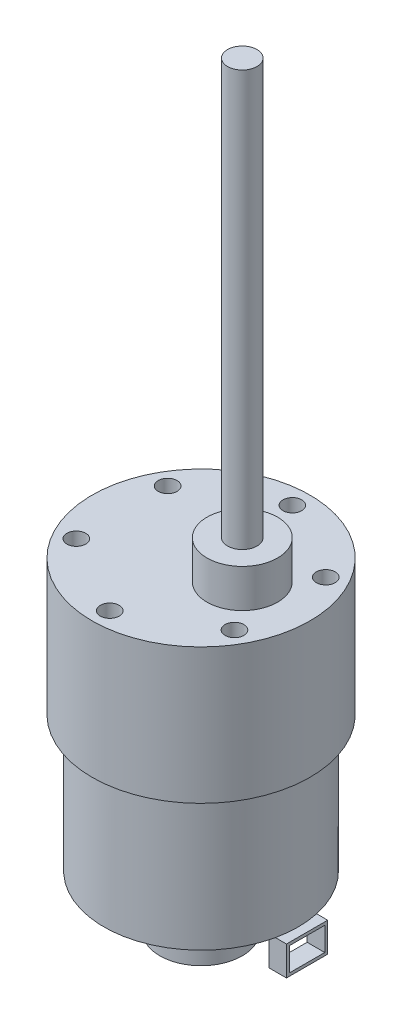
ISO-10303-21;
HEADER;
FILE_DESCRIPTION(('STEP AP214'),'2;1');
FILE_NAME('part.step','',(''),(''),'','','');
FILE_SCHEMA(('AUTOMOTIVE_DESIGN { 1 0 10303 214 1 1 1 1 }'));
ENDSEC;
DATA;
#1=APPLICATION_CONTEXT('core data for automotive mechanical design processes');
#2=APPLICATION_PROTOCOL_DEFINITION('international standard','automotive_design',2000,#1);
#3=PRODUCT_CONTEXT('',#1,'mechanical');
#4=PRODUCT('Part','Part','',(#3));
#5=PRODUCT_RELATED_PRODUCT_CATEGORY('part','',(#4));
#6=PRODUCT_DEFINITION_FORMATION('','',#4);
#7=PRODUCT_DEFINITION_CONTEXT('part definition',#1,'design');
#8=PRODUCT_DEFINITION('design','',#6,#7);
#9=PRODUCT_DEFINITION_SHAPE('','',#8);
#10=(LENGTH_UNIT() NAMED_UNIT(*) SI_UNIT(.MILLI.,.METRE.));
#11=(NAMED_UNIT(*) PLANE_ANGLE_UNIT() SI_UNIT($,.RADIAN.));
#12=(NAMED_UNIT(*) SI_UNIT($,.STERADIAN.) SOLID_ANGLE_UNIT());
#13=UNCERTAINTY_MEASURE_WITH_UNIT(LENGTH_MEASURE(1.E-05),#10,'distance_accuracy_value','');
#14=(GEOMETRIC_REPRESENTATION_CONTEXT(3) GLOBAL_UNCERTAINTY_ASSIGNED_CONTEXT((#13)) GLOBAL_UNIT_ASSIGNED_CONTEXT((#10,
#11,#12)) REPRESENTATION_CONTEXT('',''));
#15=CARTESIAN_POINT('',(0.,0.,0.));
#16=DIRECTION('',(0.,0.,1.));
#17=DIRECTION('',(1.,0.,0.));
#18=AXIS2_PLACEMENT_3D('',#15,#16,#17);
#19=CARTESIAN_POINT('',(0.,46.,0.));
#20=DIRECTION('',(0.,1.,0.));
#21=DIRECTION('',(0.,0.,1.));
#22=AXIS2_PLACEMENT_3D('',#19,#20,#21);
#23=PLANE('',#22);
#24=CARTESIAN_POINT('',(-13.4233937586588,46.,7.75000000000006));
#25=DIRECTION('',(0.,1.,0.));
#26=DIRECTION('',(0.,0.,1.));
#27=AXIS2_PLACEMENT_3D('',#24,#25,#26);
#28=CIRCLE('',#27,1.6);
#29=CARTESIAN_POINT('',(-13.4233937586588,46.,9.35000000000006));
#30=VERTEX_POINT('',#29);
#31=EDGE_CURVE('E538',#30,#30,#28,.T.);
#32=ORIENTED_EDGE('',*,*,#31,.F.);
#33=EDGE_LOOP('',(#32));
#34=FACE_BOUND('',#33,.T.);
#35=CARTESIAN_POINT('',(1.08235921504137E-13,46.,15.5));
#36=DIRECTION('',(0.,1.,0.));
#37=DIRECTION('',(0.,0.,1.));
#38=AXIS2_PLACEMENT_3D('',#35,#36,#37);
#39=CIRCLE('',#38,1.6);
#40=CARTESIAN_POINT('',(1.08235921504137E-13,46.,17.1));
#41=VERTEX_POINT('',#40);
#42=EDGE_CURVE('E537',#41,#41,#39,.T.);
#43=ORIENTED_EDGE('',*,*,#42,.F.);
#44=EDGE_LOOP('',(#43));
#45=FACE_BOUND('',#44,.T.);
#46=CARTESIAN_POINT('',(13.4233937586589,46.,7.74999999999987));
#47=DIRECTION('',(0.,1.,0.));
#48=DIRECTION('',(0.,0.,1.));
#49=AXIS2_PLACEMENT_3D('',#46,#47,#48);
#50=CIRCLE('',#49,1.6);
#51=CARTESIAN_POINT('',(13.4233937586589,46.,9.34999999999988));
#52=VERTEX_POINT('',#51);
#53=EDGE_CURVE('E547',#52,#52,#50,.T.);
#54=ORIENTED_EDGE('',*,*,#53,.F.);
#55=EDGE_LOOP('',(#54));
#56=FACE_BOUND('',#55,.T.);
#57=CARTESIAN_POINT('',(13.4233937586587,46.,-7.75000000000016));
#58=DIRECTION('',(0.,1.,0.));
#59=DIRECTION('',(0.,0.,1.));
#60=AXIS2_PLACEMENT_3D('',#57,#58,#59);
#61=CIRCLE('',#60,1.6);
#62=CARTESIAN_POINT('',(13.4233937586587,46.,-6.15000000000016));
#63=VERTEX_POINT('',#62);
#64=EDGE_CURVE('E552',#63,#63,#61,.T.);
#65=ORIENTED_EDGE('',*,*,#64,.F.);
#66=EDGE_LOOP('',(#65));
#67=FACE_BOUND('',#66,.T.);
#68=CARTESIAN_POINT('',(0.,46.,-15.5));
#69=DIRECTION('',(0.,1.,0.));
#70=DIRECTION('',(0.,0.,1.));
#71=AXIS2_PLACEMENT_3D('',#68,#69,#70);
#72=CIRCLE('',#71,1.6);
#73=CARTESIAN_POINT('',(0.,46.,-13.9));
#74=VERTEX_POINT('',#73);
#75=EDGE_CURVE('E558',#74,#74,#72,.T.);
#76=ORIENTED_EDGE('',*,*,#75,.F.);
#77=EDGE_LOOP('',(#76));
#78=FACE_BOUND('',#77,.T.);
#79=CARTESIAN_POINT('',(-13.4233937586588,46.,-7.74999999999997));
#80=DIRECTION('',(0.,1.,0.));
#81=DIRECTION('',(0.,0.,1.));
#82=AXIS2_PLACEMENT_3D('',#79,#80,#81);
#83=CIRCLE('',#82,1.6);
#84=CARTESIAN_POINT('',(-13.4233937586588,46.,-6.14999999999997));
#85=VERTEX_POINT('',#84);
#86=EDGE_CURVE('E564',#85,#85,#83,.T.);
#87=ORIENTED_EDGE('',*,*,#86,.F.);
#88=EDGE_LOOP('',(#87));
#89=FACE_BOUND('',#88,.T.);
#90=CARTESIAN_POINT('',(7.,46.,0.));
#91=DIRECTION('',(0.,1.,0.));
#92=DIRECTION('',(0.,0.,1.));
#93=AXIS2_PLACEMENT_3D('',#90,#91,#92);
#94=CIRCLE('',#93,6.);
#95=CARTESIAN_POINT('',(7.,46.,-6.));
#96=VERTEX_POINT('',#95);
#97=EDGE_CURVE('E131',#96,#96,#94,.T.);
#98=ORIENTED_EDGE('',*,*,#97,.F.);
#99=EDGE_LOOP('',(#98));
#100=FACE_BOUND('',#99,.T.);
#101=CARTESIAN_POINT('',(0.,46.,0.));
#102=DIRECTION('',(0.,1.,0.));
#103=DIRECTION('',(0.,0.,1.));
#104=AXIS2_PLACEMENT_3D('',#101,#102,#103);
#105=CIRCLE('',#104,18.5);
#106=CARTESIAN_POINT('',(0.,46.,18.5));
#107=VERTEX_POINT('',#106);
#108=EDGE_CURVE('E570',#107,#107,#105,.T.);
#109=ORIENTED_EDGE('',*,*,#108,.T.);
#110=EDGE_LOOP('',(#109));
#111=FACE_BOUND('',#110,.T.);
#112=ADVANCED_FACE('F36',(#34,#45,#56,#67,#78,#89,#100,#111),#23,.T.);
#113=CARTESIAN_POINT('',(7.,52.5,0.));
#114=DIRECTION('',(0.,-1.,0.));
#115=DIRECTION('',(0.,0.,-1.));
#116=AXIS2_PLACEMENT_3D('',#113,#114,#115);
#117=CYLINDRICAL_SURFACE('',#116,6.);
#118=CARTESIAN_POINT('',(7.,52.5,0.));
#119=DIRECTION('',(0.,1.,0.));
#120=DIRECTION('',(0.,0.,1.));
#121=AXIS2_PLACEMENT_3D('',#118,#119,#120);
#122=CIRCLE('',#121,6.);
#123=CARTESIAN_POINT('',(7.,52.5,-6.));
#124=VERTEX_POINT('',#123);
#125=EDGE_CURVE('E138',#124,#124,#122,.T.);
#126=CARTESIAN_POINT('',(7.,52.5,-6.));
#127=CARTESIAN_POINT('',(7.,52.4322916666667,-6.));
#128=CARTESIAN_POINT('',(7.,52.3645833333333,-6.));
#129=CARTESIAN_POINT('',(7.,52.2291666666667,-6.));
#130=CARTESIAN_POINT('',(7.,52.1614583333333,-6.));
#131=CARTESIAN_POINT('',(7.,52.0260416666667,-6.));
#132=CARTESIAN_POINT('',(7.,51.9583333333333,-6.));
#133=CARTESIAN_POINT('',(7.,51.8229166666667,-6.));
#134=CARTESIAN_POINT('',(7.,51.7552083333333,-6.));
#135=CARTESIAN_POINT('',(7.,51.6197916666667,-6.));
#136=CARTESIAN_POINT('',(7.,51.5520833333333,-6.));
#137=CARTESIAN_POINT('',(7.,51.4166666666667,-6.));
#138=CARTESIAN_POINT('',(7.,51.3489583333333,-6.));
#139=CARTESIAN_POINT('',(7.,51.2135416666667,-6.));
#140=CARTESIAN_POINT('',(7.,51.1458333333333,-6.));
#141=CARTESIAN_POINT('',(7.,51.0104166666667,-6.));
#142=CARTESIAN_POINT('',(7.,50.9427083333333,-6.));
#143=CARTESIAN_POINT('',(7.,50.8072916666667,-6.));
#144=CARTESIAN_POINT('',(7.,50.7395833333333,-6.));
#145=CARTESIAN_POINT('',(7.,50.6041666666667,-6.));
#146=CARTESIAN_POINT('',(7.,50.5364583333333,-6.));
#147=CARTESIAN_POINT('',(7.,50.4010416666667,-6.));
#148=CARTESIAN_POINT('',(7.,50.3333333333333,-6.));
#149=CARTESIAN_POINT('',(7.,50.1979166666667,-6.));
#150=CARTESIAN_POINT('',(7.,50.1302083333333,-6.));
#151=CARTESIAN_POINT('',(7.,49.9947916666667,-6.));
#152=CARTESIAN_POINT('',(7.,49.9270833333333,-6.));
#153=CARTESIAN_POINT('',(7.,49.7916666666667,-6.));
#154=CARTESIAN_POINT('',(7.,49.7239583333333,-6.));
#155=CARTESIAN_POINT('',(7.,49.5885416666667,-6.));
#156=CARTESIAN_POINT('',(7.,49.5208333333333,-6.));
#157=CARTESIAN_POINT('',(7.,49.3854166666667,-6.));
#158=CARTESIAN_POINT('',(7.,49.3177083333333,-6.));
#159=CARTESIAN_POINT('',(7.,49.1822916666667,-6.));
#160=CARTESIAN_POINT('',(7.,49.1145833333333,-6.));
#161=CARTESIAN_POINT('',(7.,48.9791666666667,-6.));
#162=CARTESIAN_POINT('',(7.,48.9114583333333,-6.));
#163=CARTESIAN_POINT('',(7.,48.7760416666667,-6.));
#164=CARTESIAN_POINT('',(7.,48.7083333333333,-6.));
#165=CARTESIAN_POINT('',(7.,48.5729166666667,-6.));
#166=CARTESIAN_POINT('',(7.,48.5052083333333,-6.));
#167=CARTESIAN_POINT('',(7.,48.3697916666667,-6.));
#168=CARTESIAN_POINT('',(7.,48.3020833333333,-6.));
#169=CARTESIAN_POINT('',(7.,48.1666666666667,-6.));
#170=CARTESIAN_POINT('',(7.,48.0989583333333,-6.));
#171=CARTESIAN_POINT('',(7.,47.9635416666667,-6.));
#172=CARTESIAN_POINT('',(7.,47.8958333333333,-6.));
#173=CARTESIAN_POINT('',(7.,47.7604166666667,-6.));
#174=CARTESIAN_POINT('',(7.,47.6927083333333,-6.));
#175=CARTESIAN_POINT('',(7.,47.5572916666667,-6.));
#176=CARTESIAN_POINT('',(7.,47.4895833333333,-6.));
#177=CARTESIAN_POINT('',(7.,47.3541666666667,-6.));
#178=CARTESIAN_POINT('',(7.,47.2864583333333,-6.));
#179=CARTESIAN_POINT('',(7.,47.1510416666667,-6.));
#180=CARTESIAN_POINT('',(7.,47.0833333333333,-6.));
#181=CARTESIAN_POINT('',(7.,46.9479166666667,-6.));
#182=CARTESIAN_POINT('',(7.,46.8802083333333,-6.));
#183=CARTESIAN_POINT('',(7.,46.7447916666667,-6.));
#184=CARTESIAN_POINT('',(7.,46.6770833333333,-6.));
#185=CARTESIAN_POINT('',(7.,46.5416666666667,-6.));
#186=CARTESIAN_POINT('',(7.,46.4739583333333,-6.));
#187=CARTESIAN_POINT('',(7.,46.3385416666667,-6.));
#188=CARTESIAN_POINT('',(7.,46.2708333333333,-6.));
#189=CARTESIAN_POINT('',(7.,46.1354166666667,-6.));
#190=CARTESIAN_POINT('',(7.,46.0677083333333,-6.));
#191=CARTESIAN_POINT('',(7.,46.,-6.));
#192=B_SPLINE_CURVE_WITH_KNOTS('',3,(#126,#127,#128,#129,#130,#131,#132,#133,#134,#135,#136,
#137,#138,#139,#140,#141,#142,#143,#144,#145,#146,#147,#148,#149,#150,#151,#152,#153,#154,#155,
#156,#157,#158,#159,#160,#161,#162,#163,#164,#165,#166,#167,#168,#169,#170,#171,#172,#173,#174,
#175,#176,#177,#178,#179,#180,#181,#182,#183,#184,#185,#186,#187,#188,#189,#190,#191),
.UNSPECIFIED.,.F.,.F.,(4,2,2,2,2,2,2,2,2,2,2,2,2,2,2,2,2,2,2,2,2,2,2,2,2,2,2,2,2,2,2,2,4),(0.,
0.203124999999998,0.406249999999997,0.609374999999995,0.812499999999994,1.015625,1.21875,
1.421875,1.62499999999999,1.828125,2.03125,2.234375,2.4375,2.64062499999999,2.84375,3.046875,
3.25,3.45312499999999,3.65625,3.859375,4.0625,4.26562499999999,4.46874999999999,4.671875,4.875,
5.078125,5.28124999999999,5.484375,5.6875,5.890625,6.09374999999999,6.29687499999999,6.5),.UNSPECIFIED.);
#193=EDGE_CURVE('BSEAM230',#124,#96,#192,.T.);
#194=ORIENTED_EDGE('',*,*,#125,.F.);
#195=ORIENTED_EDGE('',*,*,#97,.T.);
#196=ORIENTED_EDGE('',*,*,#193,.T.);
#197=ORIENTED_EDGE('',*,*,#193,.F.);
#198=EDGE_LOOP('',(#194,#196,#195,#197));
#199=FACE_BOUND('',#198,.T.);
#200=ADVANCED_FACE('F230',(#199),#117,.T.);
#201=CARTESIAN_POINT('',(7.,52.5,0.));
#202=DIRECTION('',(0.,1.,0.));
#203=DIRECTION('',(0.,0.,1.));
#204=AXIS2_PLACEMENT_3D('',#201,#202,#203);
#205=PLANE('',#204);
#206=CARTESIAN_POINT('',(7.,52.5,0.));
#207=DIRECTION('',(0.,1.,0.));
#208=DIRECTION('',(0.,0.,1.));
#209=AXIS2_PLACEMENT_3D('',#206,#207,#208);
#210=CIRCLE('',#209,2.5);
#211=CARTESIAN_POINT('',(7.,52.5,2.5));
#212=VERTEX_POINT('',#211);
#213=EDGE_CURVE('E576',#212,#212,#210,.T.);
#214=ORIENTED_EDGE('',*,*,#213,.F.);
#215=EDGE_LOOP('',(#214));
#216=FACE_BOUND('',#215,.T.);
#217=ORIENTED_EDGE('',*,*,#125,.T.);
#218=EDGE_LOOP('',(#217));
#219=FACE_BOUND('',#218,.T.);
#220=ADVANCED_FACE('F236',(#216,#219),#205,.T.);
#221=CARTESIAN_POINT('',(7.,123.,0.));
#222=DIRECTION('',(0.,-1.,0.));
#223=DIRECTION('',(0.,0.,-1.));
#224=AXIS2_PLACEMENT_3D('',#221,#222,#223);
#225=CYLINDRICAL_SURFACE('',#224,2.5);
#226=CARTESIAN_POINT('',(7.,123.,0.));
#227=DIRECTION('',(0.,1.,0.));
#228=DIRECTION('',(0.,0.,1.));
#229=AXIS2_PLACEMENT_3D('',#226,#227,#228);
#230=CIRCLE('',#229,2.5);
#231=CARTESIAN_POINT('',(7.,123.,2.5));
#232=VERTEX_POINT('',#231);
#233=EDGE_CURVE('E579',#232,#232,#230,.T.);
#234=ORIENTED_EDGE('',*,*,#233,.F.);
#235=EDGE_LOOP('',(#234));
#236=FACE_BOUND('',#235,.T.);
#237=ORIENTED_EDGE('',*,*,#213,.T.);
#238=EDGE_LOOP('',(#237));
#239=FACE_BOUND('',#238,.T.);
#240=ADVANCED_FACE('F281',(#236,#239),#225,.T.);
#241=CARTESIAN_POINT('',(7.,123.,0.));
#242=DIRECTION('',(0.,1.,0.));
#243=DIRECTION('',(0.,0.,1.));
#244=AXIS2_PLACEMENT_3D('',#241,#242,#243);
#245=PLANE('',#244);
#246=ORIENTED_EDGE('',*,*,#233,.T.);
#247=EDGE_LOOP('',(#246));
#248=FACE_BOUND('',#247,.T.);
#249=ADVANCED_FACE('F271',(#248),#245,.T.);
#250=CARTESIAN_POINT('',(0.,23.,0.));
#251=DIRECTION('',(0.,1.,0.));
#252=DIRECTION('',(0.,0.,1.));
#253=AXIS2_PLACEMENT_3D('',#250,#251,#252);
#254=CYLINDRICAL_SURFACE('',#253,18.5);
#255=CARTESIAN_POINT('',(0.,23.,0.));
#256=DIRECTION('',(0.,1.,0.));
#257=DIRECTION('',(0.,0.,1.));
#258=AXIS2_PLACEMENT_3D('',#255,#256,#257);
#259=CIRCLE('',#258,18.5);
#260=CARTESIAN_POINT('',(0.,23.,18.5));
#261=VERTEX_POINT('',#260);
#262=EDGE_CURVE('E573',#261,#261,#259,.T.);
#263=ORIENTED_EDGE('',*,*,#262,.T.);
#264=EDGE_LOOP('',(#263));
#265=FACE_BOUND('',#264,.T.);
#266=ORIENTED_EDGE('',*,*,#108,.F.);
#267=EDGE_LOOP('',(#266));
#268=FACE_BOUND('',#267,.T.);
#269=ADVANCED_FACE('F264',(#265,#268),#254,.T.);
#270=CARTESIAN_POINT('',(0.,23.,0.));
#271=DIRECTION('',(0.,1.,0.));
#272=DIRECTION('',(0.,0.,1.));
#273=AXIS2_PLACEMENT_3D('',#270,#271,#272);
#274=PLANE('',#273);
#275=CARTESIAN_POINT('',(0.,23.,0.));
#276=DIRECTION('',(0.,1.,0.));
#277=DIRECTION('',(0.,0.,1.));
#278=AXIS2_PLACEMENT_3D('',#275,#276,#277);
#279=CIRCLE('',#278,16.5);
#280=CARTESIAN_POINT('',(0.,23.,16.5));
#281=VERTEX_POINT('',#280);
#282=EDGE_CURVE('E11',#281,#281,#279,.T.);
#283=ORIENTED_EDGE('',*,*,#282,.T.);
#284=EDGE_LOOP('',(#283));
#285=FACE_BOUND('',#284,.T.);
#286=ORIENTED_EDGE('',*,*,#262,.F.);
#287=EDGE_LOOP('',(#286));
#288=FACE_BOUND('',#287,.T.);
#289=ADVANCED_FACE('F256',(#285,#288),#274,.F.);
#290=CARTESIAN_POINT('',(0.,-9.,0.));
#291=DIRECTION('',(0.,-1.,0.));
#292=DIRECTION('',(0.,0.,-1.));
#293=AXIS2_PLACEMENT_3D('',#290,#291,#292);
#294=PLANE('',#293);
#295=CARTESIAN_POINT('',(0.,-9.,0.));
#296=DIRECTION('',(0.,-1.,0.));
#297=DIRECTION('',(0.,0.,-1.));
#298=AXIS2_PLACEMENT_3D('',#295,#296,#297);
#299=CIRCLE('',#298,7.);
#300=CARTESIAN_POINT('',(0.,-9.,-7.));
#301=VERTEX_POINT('',#300);
#302=EDGE_CURVE('E181',#301,#301,#299,.T.);
#303=ORIENTED_EDGE('',*,*,#302,.T.);
#304=EDGE_LOOP('',(#303));
#305=FACE_BOUND('',#304,.T.);
#306=ADVANCED_FACE('F253',(#305),#294,.T.);
#307=CARTESIAN_POINT('',(15.,-4.5,-3.));
#308=DIRECTION('',(0.,0.,-1.));
#309=DIRECTION('',(-1.,0.,0.));
#310=AXIS2_PLACEMENT_3D('',#307,#308,#309);
#311=PLANE('',#310);
#312=DIRECTION('',(0.,1.,0.));
#313=VECTOR('',#312,1.);
#314=CARTESIAN_POINT('',(18.,-4.5,-3.));
#315=LINE('',#314,#313);
#316=CARTESIAN_POINT('',(18.,-4.5,-3.));
#317=VERTEX_POINT('',#316);
#318=CARTESIAN_POINT('',(18.,-0.499999999999999,-3.));
#319=VERTEX_POINT('',#318);
#320=EDGE_CURVE('E128',#317,#319,#315,.T.);
#321=ORIENTED_EDGE('',*,*,#320,.T.);
#322=DIRECTION('',(1.,0.,0.));
#323=VECTOR('',#322,1.);
#324=CARTESIAN_POINT('',(15.,-0.499999999999999,-3.));
#325=LINE('',#324,#323);
#326=CARTESIAN_POINT('',(15.,-0.499999999999999,-3.));
#327=VERTEX_POINT('',#326);
#328=EDGE_CURVE('E145',#327,#319,#325,.T.);
#329=ORIENTED_EDGE('',*,*,#328,.F.);
#330=DIRECTION('',(0.,1.,0.));
#331=VECTOR('',#330,1.);
#332=CARTESIAN_POINT('',(15.,-4.5,-3.));
#333=LINE('',#332,#331);
#334=CARTESIAN_POINT('',(15.,-4.5,-3.));
#335=VERTEX_POINT('',#334);
#336=EDGE_CURVE('E59',#335,#327,#333,.T.);
#337=ORIENTED_EDGE('',*,*,#336,.F.);
#338=DIRECTION('',(1.,0.,0.));
#339=VECTOR('',#338,1.);
#340=CARTESIAN_POINT('',(15.,-4.5,-3.));
#341=LINE('',#340,#339);
#342=EDGE_CURVE('E114',#335,#317,#341,.T.);
#343=ORIENTED_EDGE('',*,*,#342,.T.);
#344=EDGE_LOOP('',(#321,#329,#337,#343));
#345=FACE_BOUND('',#344,.T.);
#346=ADVANCED_FACE('F255',(#345),#311,.F.);
#347=CARTESIAN_POINT('',(15.,-0.499999999999999,-3.));
#348=DIRECTION('',(0.,1.,0.));
#349=DIRECTION('',(0.,0.,1.));
#350=AXIS2_PLACEMENT_3D('',#347,#348,#349);
#351=PLANE('',#350);
#352=DIRECTION('',(0.,0.,1.));
#353=VECTOR('',#352,1.);
#354=CARTESIAN_POINT('',(18.,-0.499999999999999,-3.));
#355=LINE('',#354,#353);
#356=CARTESIAN_POINT('',(18.,-0.5,3.));
#357=VERTEX_POINT('',#356);
#358=EDGE_CURVE('E125',#319,#357,#355,.T.);
#359=ORIENTED_EDGE('',*,*,#358,.T.);
#360=DIRECTION('',(1.,0.,0.));
#361=VECTOR('',#360,1.);
#362=CARTESIAN_POINT('',(15.,-0.5,3.));
#363=LINE('',#362,#361);
#364=CARTESIAN_POINT('',(15.,-0.5,3.));
#365=VERTEX_POINT('',#364);
#366=EDGE_CURVE('E142',#365,#357,#363,.T.);
#367=ORIENTED_EDGE('',*,*,#366,.F.);
#368=DIRECTION('',(0.,0.,1.));
#369=VECTOR('',#368,1.);
#370=CARTESIAN_POINT('',(15.,-0.499999999999999,-3.));
#371=LINE('',#370,#369);
#372=EDGE_CURVE('E115',#327,#365,#371,.T.);
#373=ORIENTED_EDGE('',*,*,#372,.F.);
#374=ORIENTED_EDGE('',*,*,#328,.T.);
#375=EDGE_LOOP('',(#359,#367,#373,#374));
#376=FACE_BOUND('',#375,.T.);
#377=ADVANCED_FACE('F262',(#376),#351,.F.);
#378=CARTESIAN_POINT('',(15.,-4.5,3.));
#379=DIRECTION('',(0.,0.,1.));
#380=DIRECTION('',(1.,0.,0.));
#381=AXIS2_PLACEMENT_3D('',#378,#379,#380);
#382=PLANE('',#381);
#383=DIRECTION('',(0.,-1.,0.));
#384=VECTOR('',#383,1.);
#385=CARTESIAN_POINT('',(18.,-4.5,3.));
#386=LINE('',#385,#384);
#387=CARTESIAN_POINT('',(18.,-4.5,3.));
#388=VERTEX_POINT('',#387);
#389=EDGE_CURVE('E51',#357,#388,#386,.T.);
#390=ORIENTED_EDGE('',*,*,#389,.T.);
#391=DIRECTION('',(1.,0.,0.));
#392=VECTOR('',#391,1.);
#393=CARTESIAN_POINT('',(15.,-4.5,3.));
#394=LINE('',#393,#392);
#395=CARTESIAN_POINT('',(15.,-4.5,3.));
#396=VERTEX_POINT('',#395);
#397=EDGE_CURVE('E105',#396,#388,#394,.T.);
#398=ORIENTED_EDGE('',*,*,#397,.F.);
#399=DIRECTION('',(0.,-1.,0.));
#400=VECTOR('',#399,1.);
#401=CARTESIAN_POINT('',(15.,-4.5,3.));
#402=LINE('',#401,#400);
#403=EDGE_CURVE('E109',#365,#396,#402,.T.);
#404=ORIENTED_EDGE('',*,*,#403,.F.);
#405=ORIENTED_EDGE('',*,*,#366,.T.);
#406=EDGE_LOOP('',(#390,#398,#404,#405));
#407=FACE_BOUND('',#406,.T.);
#408=ADVANCED_FACE('F107',(#407),#382,.F.);
#409=CARTESIAN_POINT('',(15.,-4.5,-3.));
#410=DIRECTION('',(0.,-1.,0.));
#411=DIRECTION('',(0.,0.,-1.));
#412=AXIS2_PLACEMENT_3D('',#409,#410,#411);
#413=PLANE('',#412);
#414=DIRECTION('',(0.,0.,-1.));
#415=VECTOR('',#414,1.);
#416=CARTESIAN_POINT('',(18.,-4.5,-3.));
#417=LINE('',#416,#415);
#418=EDGE_CURVE('E137',#388,#317,#417,.T.);
#419=ORIENTED_EDGE('',*,*,#418,.T.);
#420=ORIENTED_EDGE('',*,*,#342,.F.);
#421=DIRECTION('',(0.,0.,-1.));
#422=VECTOR('',#421,1.);
#423=CARTESIAN_POINT('',(15.,-4.5,-3.));
#424=LINE('',#423,#422);
#425=EDGE_CURVE('E118',#396,#335,#424,.T.);
#426=ORIENTED_EDGE('',*,*,#425,.F.);
#427=ORIENTED_EDGE('',*,*,#397,.T.);
#428=EDGE_LOOP('',(#419,#420,#426,#427));
#429=FACE_BOUND('',#428,.T.);
#430=ADVANCED_FACE('F119',(#429),#413,.F.);
#431=CARTESIAN_POINT('',(0.,-5.,0.));
#432=DIRECTION('',(0.,1.,0.));
#433=DIRECTION('',(0.,0.,1.));
#434=AXIS2_PLACEMENT_3D('',#431,#432,#433);
#435=PLANE('',#434);
#436=DIRECTION('',(0.,0.,1.));
#437=VECTOR('',#436,1.);
#438=CARTESIAN_POINT('',(18.,-5.,-3.5));
#439=LINE('',#438,#437);
#440=CARTESIAN_POINT('',(18.,-5.,-3.5));
#441=VERTEX_POINT('',#440);
#442=CARTESIAN_POINT('',(18.,-5.,3.5));
#443=VERTEX_POINT('',#442);
#444=EDGE_CURVE('E148',#441,#443,#439,.T.);
#445=ORIENTED_EDGE('',*,*,#444,.T.);
#446=DIRECTION('',(-1.,0.,0.));
#447=VECTOR('',#446,1.);
#448=CARTESIAN_POINT('',(15.,-5.,3.5));
#449=LINE('',#448,#447);
#450=CARTESIAN_POINT('',(15.,-5.,3.5));
#451=VERTEX_POINT('',#450);
#452=EDGE_CURVE('E151',#443,#451,#449,.T.);
#453=ORIENTED_EDGE('',*,*,#452,.T.);
#454=DIRECTION('',(0.,0.,-1.));
#455=VECTOR('',#454,1.);
#456=CARTESIAN_POINT('',(15.,-5.,-3.5));
#457=LINE('',#456,#455);
#458=CARTESIAN_POINT('',(15.,-5.,-3.5));
#459=VERTEX_POINT('',#458);
#460=EDGE_CURVE('E154',#451,#459,#457,.T.);
#461=ORIENTED_EDGE('',*,*,#460,.T.);
#462=DIRECTION('',(1.,0.,0.));
#463=VECTOR('',#462,1.);
#464=CARTESIAN_POINT('',(15.,-5.,-3.5));
#465=LINE('',#464,#463);
#466=EDGE_CURVE('E156',#459,#441,#465,.T.);
#467=ORIENTED_EDGE('',*,*,#466,.T.);
#468=EDGE_LOOP('',(#445,#453,#461,#467));
#469=FACE_BOUND('',#468,.T.);
#470=ADVANCED_FACE('F200',(#469),#435,.F.);
#471=CARTESIAN_POINT('',(15.,-5.,-3.5));
#472=DIRECTION('',(1.,0.,0.));
#473=DIRECTION('',(0.,0.,-1.));
#474=AXIS2_PLACEMENT_3D('',#471,#472,#473);
#475=PLANE('',#474);
#476=ORIENTED_EDGE('',*,*,#372,.T.);
#477=ORIENTED_EDGE('',*,*,#403,.T.);
#478=ORIENTED_EDGE('',*,*,#425,.T.);
#479=ORIENTED_EDGE('',*,*,#336,.T.);
#480=EDGE_LOOP('',(#476,#477,#478,#479));
#481=FACE_BOUND('',#480,.T.);
#482=DIRECTION('',(0.,0.,-1.));
#483=VECTOR('',#482,1.);
#484=CARTESIAN_POINT('',(15.,0.,-3.5));
#485=LINE('',#484,#483);
#486=CARTESIAN_POINT('',(15.,0.,3.5));
#487=VERTEX_POINT('',#486);
#488=CARTESIAN_POINT('',(15.,0.,-3.5));
#489=VERTEX_POINT('',#488);
#490=EDGE_CURVE('E164',#487,#489,#485,.T.);
#491=ORIENTED_EDGE('',*,*,#490,.T.);
#492=DIRECTION('',(0.,1.,0.));
#493=VECTOR('',#492,1.);
#494=CARTESIAN_POINT('',(15.,-5.,-3.5));
#495=LINE('',#494,#493);
#496=EDGE_CURVE('E172',#459,#489,#495,.T.);
#497=ORIENTED_EDGE('',*,*,#496,.F.);
#498=ORIENTED_EDGE('',*,*,#460,.F.);
#499=DIRECTION('',(0.,1.,0.));
#500=VECTOR('',#499,1.);
#501=CARTESIAN_POINT('',(15.,-5.,3.5));
#502=LINE('',#501,#500);
#503=EDGE_CURVE('E175',#451,#487,#502,.T.);
#504=ORIENTED_EDGE('',*,*,#503,.T.);
#505=EDGE_LOOP('',(#491,#497,#498,#504));
#506=FACE_BOUND('',#505,.T.);
#507=ADVANCED_FACE('F122',(#481,#506),#475,.F.);
#508=CARTESIAN_POINT('',(0.,-9.,0.));
#509=DIRECTION('',(0.,1.,0.));
#510=DIRECTION('',(0.,0.,1.));
#511=AXIS2_PLACEMENT_3D('',#508,#509,#510);
#512=CYLINDRICAL_SURFACE('',#511,7.);
#513=ORIENTED_EDGE('',*,*,#302,.F.);
#514=EDGE_LOOP('',(#513));
#515=FACE_BOUND('',#514,.T.);
#516=CARTESIAN_POINT('',(0.,0.,0.));
#517=DIRECTION('',(0.,1.,0.));
#518=DIRECTION('',(0.,0.,1.));
#519=AXIS2_PLACEMENT_3D('',#516,#517,#518);
#520=CIRCLE('',#519,7.);
#521=CARTESIAN_POINT('',(0.,0.,7.));
#522=VERTEX_POINT('',#521);
#523=EDGE_CURVE('E187',#522,#522,#520,.F.);
#524=ORIENTED_EDGE('',*,*,#523,.T.);
#525=EDGE_LOOP('',(#524));
#526=FACE_BOUND('',#525,.T.);
#527=ADVANCED_FACE('F217',(#515,#526),#512,.T.);
#528=CARTESIAN_POINT('',(15.,-5.,-3.5));
#529=DIRECTION('',(0.,0.,1.));
#530=DIRECTION('',(1.,0.,0.));
#531=AXIS2_PLACEMENT_3D('',#528,#529,#530);
#532=PLANE('',#531);
#533=DIRECTION('',(1.,0.,0.));
#534=VECTOR('',#533,1.);
#535=CARTESIAN_POINT('',(15.,0.,-3.5));
#536=LINE('',#535,#534);
#537=CARTESIAN_POINT('',(16.1245154965971,0.,-3.5));
#538=VERTEX_POINT('',#537);
#539=EDGE_CURVE('E152',#489,#538,#536,.T.);
#540=ORIENTED_EDGE('',*,*,#539,.T.);
#541=CARTESIAN_POINT('',(18.,0.,-3.5));
#542=VERTEX_POINT('',#541);
#543=EDGE_CURVE('E167',#538,#542,#536,.T.);
#544=ORIENTED_EDGE('',*,*,#543,.T.);
#545=DIRECTION('',(0.,1.,0.));
#546=VECTOR('',#545,1.);
#547=CARTESIAN_POINT('',(18.,-5.,-3.5));
#548=LINE('',#547,#546);
#549=EDGE_CURVE('E158',#441,#542,#548,.T.);
#550=ORIENTED_EDGE('',*,*,#549,.F.);
#551=ORIENTED_EDGE('',*,*,#466,.F.);
#552=ORIENTED_EDGE('',*,*,#496,.T.);
#553=EDGE_LOOP('',(#540,#544,#550,#551,#552));
#554=FACE_BOUND('',#553,.T.);
#555=ADVANCED_FACE('F215',(#554),#532,.F.);
#556=CARTESIAN_POINT('',(18.,-5.,-3.5));
#557=DIRECTION('',(-1.,0.,0.));
#558=DIRECTION('',(0.,0.,1.));
#559=AXIS2_PLACEMENT_3D('',#556,#557,#558);
#560=PLANE('',#559);
#561=ORIENTED_EDGE('',*,*,#418,.F.);
#562=ORIENTED_EDGE('',*,*,#389,.F.);
#563=ORIENTED_EDGE('',*,*,#358,.F.);
#564=ORIENTED_EDGE('',*,*,#320,.F.);
#565=EDGE_LOOP('',(#561,#562,#563,#564));
#566=FACE_BOUND('',#565,.T.);
#567=DIRECTION('',(0.,0.,1.));
#568=VECTOR('',#567,1.);
#569=CARTESIAN_POINT('',(18.,0.,-3.5));
#570=LINE('',#569,#568);
#571=CARTESIAN_POINT('',(18.,0.,3.5));
#572=VERTEX_POINT('',#571);
#573=EDGE_CURVE('E144',#542,#572,#570,.T.);
#574=ORIENTED_EDGE('',*,*,#573,.T.);
#575=DIRECTION('',(0.,1.,0.));
#576=VECTOR('',#575,1.);
#577=CARTESIAN_POINT('',(18.,-5.,3.5));
#578=LINE('',#577,#576);
#579=EDGE_CURVE('E178',#443,#572,#578,.T.);
#580=ORIENTED_EDGE('',*,*,#579,.F.);
#581=ORIENTED_EDGE('',*,*,#444,.F.);
#582=ORIENTED_EDGE('',*,*,#549,.T.);
#583=EDGE_LOOP('',(#574,#580,#581,#582));
#584=FACE_BOUND('',#583,.T.);
#585=ADVANCED_FACE('F206',(#566,#584),#560,.F.);
#586=CARTESIAN_POINT('',(15.,-5.,3.5));
#587=DIRECTION('',(0.,0.,-1.));
#588=DIRECTION('',(-1.,0.,0.));
#589=AXIS2_PLACEMENT_3D('',#586,#587,#588);
#590=PLANE('',#589);
#591=DIRECTION('',(-1.,0.,0.));
#592=VECTOR('',#591,1.);
#593=CARTESIAN_POINT('',(15.,0.,3.5));
#594=LINE('',#593,#592);
#595=CARTESIAN_POINT('',(16.1245154965971,0.,3.5));
#596=VERTEX_POINT('',#595);
#597=EDGE_CURVE('E161',#572,#596,#594,.T.);
#598=ORIENTED_EDGE('',*,*,#597,.T.);
#599=DIRECTION('',(-1.,0.,0.));
#600=VECTOR('',#599,1.);
#601=CARTESIAN_POINT('',(0.,0.,3.5));
#602=LINE('',#601,#600);
#603=EDGE_CURVE('E44',#596,#487,#602,.T.);
#604=ORIENTED_EDGE('',*,*,#603,.T.);
#605=ORIENTED_EDGE('',*,*,#503,.F.);
#606=ORIENTED_EDGE('',*,*,#452,.F.);
#607=ORIENTED_EDGE('',*,*,#579,.T.);
#608=EDGE_LOOP('',(#598,#604,#605,#606,#607));
#609=FACE_BOUND('',#608,.T.);
#610=ADVANCED_FACE('F192',(#609),#590,.F.);
#611=CARTESIAN_POINT('',(0.,0.,0.));
#612=DIRECTION('',(0.,1.,0.));
#613=DIRECTION('',(0.,0.,1.));
#614=AXIS2_PLACEMENT_3D('',#611,#612,#613);
#615=PLANE('',#614);
#616=ORIENTED_EDGE('',*,*,#523,.F.);
#617=EDGE_LOOP('',(#616));
#618=FACE_BOUND('',#617,.T.);
#619=ORIENTED_EDGE('',*,*,#603,.F.);
#620=CARTESIAN_POINT('',(0.,0.,0.));
#621=DIRECTION('',(0.,1.,0.));
#622=DIRECTION('',(0.,0.,1.));
#623=AXIS2_PLACEMENT_3D('',#620,#621,#622);
#624=CIRCLE('',#623,16.5);
#625=EDGE_CURVE('E184',#538,#596,#624,.T.);
#626=ORIENTED_EDGE('',*,*,#625,.F.);
#627=ORIENTED_EDGE('',*,*,#539,.F.);
#628=ORIENTED_EDGE('',*,*,#490,.F.);
#629=EDGE_LOOP('',(#619,#626,#627,#628));
#630=FACE_BOUND('',#629,.T.);
#631=ADVANCED_FACE('F213',(#618,#630),#615,.F.);
#632=CARTESIAN_POINT('',(0.,0.,0.));
#633=DIRECTION('',(0.,1.,0.));
#634=DIRECTION('',(0.,0.,1.));
#635=AXIS2_PLACEMENT_3D('',#632,#633,#634);
#636=PLANE('',#635);
#637=EDGE_CURVE('E185',#596,#538,#624,.T.);
#638=ORIENTED_EDGE('',*,*,#637,.F.);
#639=ORIENTED_EDGE('',*,*,#597,.F.);
#640=ORIENTED_EDGE('',*,*,#573,.F.);
#641=ORIENTED_EDGE('',*,*,#543,.F.);
#642=EDGE_LOOP('',(#638,#639,#640,#641));
#643=FACE_BOUND('',#642,.T.);
#644=ADVANCED_FACE('F210',(#643),#636,.T.);
#645=CARTESIAN_POINT('',(0.,46.,0.));
#646=DIRECTION('',(0.,-1.,0.));
#647=DIRECTION('',(0.,0.,-1.));
#648=AXIS2_PLACEMENT_3D('',#645,#646,#647);
#649=CYLINDRICAL_SURFACE('',#648,16.5);
#650=ORIENTED_EDGE('',*,*,#637,.T.);
#651=ORIENTED_EDGE('',*,*,#625,.T.);
#652=EDGE_LOOP('',(#650,#651));
#653=FACE_BOUND('',#652,.T.);
#654=ORIENTED_EDGE('',*,*,#282,.F.);
#655=EDGE_LOOP('',(#654));
#656=FACE_BOUND('',#655,.T.);
#657=ADVANCED_FACE('F38',(#653,#656),#649,.T.);
#658=CARTESIAN_POINT('',(-13.4233937586588,36.,-7.74999999999997));
#659=DIRECTION('',(0.,1.,0.));
#660=DIRECTION('',(0.,0.,1.));
#661=AXIS2_PLACEMENT_3D('',#658,#659,#660);
#662=CYLINDRICAL_SURFACE('',#661,1.6);
#663=CARTESIAN_POINT('',(-13.4233937586588,36.,-7.74999999999997));
#664=DIRECTION('',(0.,1.,0.));
#665=DIRECTION('',(0.,0.,1.));
#666=AXIS2_PLACEMENT_3D('',#663,#664,#665);
#667=CIRCLE('',#666,1.6);
#668=CARTESIAN_POINT('',(-13.4233937586588,36.,-6.14999999999997));
#669=VERTEX_POINT('',#668);
#670=EDGE_CURVE('E567',#669,#669,#667,.T.);
#671=ORIENTED_EDGE('',*,*,#670,.F.);
#672=EDGE_LOOP('',(#671));
#673=FACE_BOUND('',#672,.T.);
#674=ORIENTED_EDGE('',*,*,#86,.T.);
#675=EDGE_LOOP('',(#674));
#676=FACE_BOUND('',#675,.T.);
#677=ADVANCED_FACE('F276',(#673,#676),#662,.F.);
#678=CARTESIAN_POINT('',(0.,36.,0.));
#679=DIRECTION('',(0.,1.,0.));
#680=DIRECTION('',(0.,0.,1.));
#681=AXIS2_PLACEMENT_3D('',#678,#679,#680);
#682=PLANE('',#681);
#683=ORIENTED_EDGE('',*,*,#670,.T.);
#684=EDGE_LOOP('',(#683));
#685=FACE_BOUND('',#684,.T.);
#686=ADVANCED_FACE('F354',(#685),#682,.T.);
#687=CARTESIAN_POINT('',(0.,36.,-15.5));
#688=DIRECTION('',(0.,1.,0.));
#689=DIRECTION('',(0.,0.,1.));
#690=AXIS2_PLACEMENT_3D('',#687,#688,#689);
#691=CYLINDRICAL_SURFACE('',#690,1.6);
#692=CARTESIAN_POINT('',(0.,36.,-15.5));
#693=DIRECTION('',(0.,1.,0.));
#694=DIRECTION('',(0.,0.,1.));
#695=AXIS2_PLACEMENT_3D('',#692,#693,#694);
#696=CIRCLE('',#695,1.6);
#697=CARTESIAN_POINT('',(0.,36.,-13.9));
#698=VERTEX_POINT('',#697);
#699=EDGE_CURVE('E561',#698,#698,#696,.T.);
#700=ORIENTED_EDGE('',*,*,#699,.F.);
#701=EDGE_LOOP('',(#700));
#702=FACE_BOUND('',#701,.T.);
#703=ORIENTED_EDGE('',*,*,#75,.T.);
#704=EDGE_LOOP('',(#703));
#705=FACE_BOUND('',#704,.T.);
#706=ADVANCED_FACE('F361',(#702,#705),#691,.F.);
#707=CARTESIAN_POINT('',(0.,36.,0.));
#708=DIRECTION('',(0.,1.,0.));
#709=DIRECTION('',(0.,0.,1.));
#710=AXIS2_PLACEMENT_3D('',#707,#708,#709);
#711=PLANE('',#710);
#712=ORIENTED_EDGE('',*,*,#699,.T.);
#713=EDGE_LOOP('',(#712));
#714=FACE_BOUND('',#713,.T.);
#715=ADVANCED_FACE('F368',(#714),#711,.T.);
#716=CARTESIAN_POINT('',(13.4233937586587,36.,-7.75000000000016));
#717=DIRECTION('',(0.,1.,0.));
#718=DIRECTION('',(0.,0.,1.));
#719=AXIS2_PLACEMENT_3D('',#716,#717,#718);
#720=CYLINDRICAL_SURFACE('',#719,1.6);
#721=CARTESIAN_POINT('',(13.4233937586587,36.,-7.75000000000016));
#722=DIRECTION('',(0.,1.,0.));
#723=DIRECTION('',(0.,0.,1.));
#724=AXIS2_PLACEMENT_3D('',#721,#722,#723);
#725=CIRCLE('',#724,1.6);
#726=CARTESIAN_POINT('',(13.4233937586587,36.,-6.15000000000016));
#727=VERTEX_POINT('',#726);
#728=EDGE_CURVE('E555',#727,#727,#725,.T.);
#729=ORIENTED_EDGE('',*,*,#728,.F.);
#730=EDGE_LOOP('',(#729));
#731=FACE_BOUND('',#730,.T.);
#732=ORIENTED_EDGE('',*,*,#64,.T.);
#733=EDGE_LOOP('',(#732));
#734=FACE_BOUND('',#733,.T.);
#735=ADVANCED_FACE('F376',(#731,#734),#720,.F.);
#736=CARTESIAN_POINT('',(0.,36.,0.));
#737=DIRECTION('',(0.,1.,0.));
#738=DIRECTION('',(0.,0.,1.));
#739=AXIS2_PLACEMENT_3D('',#736,#737,#738);
#740=PLANE('',#739);
#741=ORIENTED_EDGE('',*,*,#728,.T.);
#742=EDGE_LOOP('',(#741));
#743=FACE_BOUND('',#742,.T.);
#744=ADVANCED_FACE('F384',(#743),#740,.T.);
#745=CARTESIAN_POINT('',(13.4233937586589,36.,7.74999999999987));
#746=DIRECTION('',(0.,1.,0.));
#747=DIRECTION('',(0.,0.,1.));
#748=AXIS2_PLACEMENT_3D('',#745,#746,#747);
#749=CYLINDRICAL_SURFACE('',#748,1.6);
#750=CARTESIAN_POINT('',(13.4233937586589,36.,7.74999999999987));
#751=DIRECTION('',(0.,1.,0.));
#752=DIRECTION('',(0.,0.,1.));
#753=AXIS2_PLACEMENT_3D('',#750,#751,#752);
#754=CIRCLE('',#753,1.6);
#755=CARTESIAN_POINT('',(13.4233937586589,36.,9.34999999999988));
#756=VERTEX_POINT('',#755);
#757=EDGE_CURVE('E549',#756,#756,#754,.T.);
#758=ORIENTED_EDGE('',*,*,#757,.F.);
#759=EDGE_LOOP('',(#758));
#760=FACE_BOUND('',#759,.T.);
#761=ORIENTED_EDGE('',*,*,#53,.T.);
#762=EDGE_LOOP('',(#761));
#763=FACE_BOUND('',#762,.T.);
#764=ADVANCED_FACE('F392',(#760,#763),#749,.F.);
#765=CARTESIAN_POINT('',(0.,36.,0.));
#766=DIRECTION('',(0.,1.,0.));
#767=DIRECTION('',(0.,0.,1.));
#768=AXIS2_PLACEMENT_3D('',#765,#766,#767);
#769=PLANE('',#768);
#770=ORIENTED_EDGE('',*,*,#757,.T.);
#771=EDGE_LOOP('',(#770));
#772=FACE_BOUND('',#771,.T.);
#773=ADVANCED_FACE('F400',(#772),#769,.T.);
#774=CARTESIAN_POINT('',(1.08235921504137E-13,36.,15.5));
#775=DIRECTION('',(0.,1.,0.));
#776=DIRECTION('',(0.,0.,1.));
#777=AXIS2_PLACEMENT_3D('',#774,#775,#776);
#778=CYLINDRICAL_SURFACE('',#777,1.6);
#779=CARTESIAN_POINT('',(1.08235921504137E-13,36.,15.5));
#780=DIRECTION('',(0.,1.,0.));
#781=DIRECTION('',(0.,0.,1.));
#782=AXIS2_PLACEMENT_3D('',#779,#780,#781);
#783=CIRCLE('',#782,1.6);
#784=CARTESIAN_POINT('',(1.08235921504137E-13,36.,17.1));
#785=VERTEX_POINT('',#784);
#786=EDGE_CURVE('E541',#785,#785,#783,.T.);
#787=ORIENTED_EDGE('',*,*,#786,.F.);
#788=EDGE_LOOP('',(#787));
#789=FACE_BOUND('',#788,.T.);
#790=ORIENTED_EDGE('',*,*,#42,.T.);
#791=EDGE_LOOP('',(#790));
#792=FACE_BOUND('',#791,.T.);
#793=ADVANCED_FACE('F408',(#789,#792),#778,.F.);
#794=CARTESIAN_POINT('',(0.,36.,0.));
#795=DIRECTION('',(0.,1.,0.));
#796=DIRECTION('',(0.,0.,1.));
#797=AXIS2_PLACEMENT_3D('',#794,#795,#796);
#798=PLANE('',#797);
#799=ORIENTED_EDGE('',*,*,#786,.T.);
#800=EDGE_LOOP('',(#799));
#801=FACE_BOUND('',#800,.T.);
#802=ADVANCED_FACE('F416',(#801),#798,.T.);
#803=CARTESIAN_POINT('',(-13.4233937586588,36.,7.75000000000006));
#804=DIRECTION('',(0.,1.,0.));
#805=DIRECTION('',(0.,0.,1.));
#806=AXIS2_PLACEMENT_3D('',#803,#804,#805);
#807=CYLINDRICAL_SURFACE('',#806,1.6);
#808=CARTESIAN_POINT('',(-13.4233937586588,36.,7.75000000000006));
#809=DIRECTION('',(0.,1.,0.));
#810=DIRECTION('',(0.,0.,1.));
#811=AXIS2_PLACEMENT_3D('',#808,#809,#810);
#812=CIRCLE('',#811,1.6);
#813=CARTESIAN_POINT('',(-13.4233937586588,36.,9.35000000000006));
#814=VERTEX_POINT('',#813);
#815=EDGE_CURVE('E536',#814,#814,#812,.T.);
#816=ORIENTED_EDGE('',*,*,#815,.F.);
#817=EDGE_LOOP('',(#816));
#818=FACE_BOUND('',#817,.T.);
#819=ORIENTED_EDGE('',*,*,#31,.T.);
#820=EDGE_LOOP('',(#819));
#821=FACE_BOUND('',#820,.T.);
#822=ADVANCED_FACE('F424',(#818,#821),#807,.F.);
#823=CARTESIAN_POINT('',(0.,36.,0.));
#824=DIRECTION('',(0.,1.,0.));
#825=DIRECTION('',(0.,0.,1.));
#826=AXIS2_PLACEMENT_3D('',#823,#824,#825);
#827=PLANE('',#826);
#828=ORIENTED_EDGE('',*,*,#815,.T.);
#829=EDGE_LOOP('',(#828));
#830=FACE_BOUND('',#829,.T.);
#831=ADVANCED_FACE('F432',(#830),#827,.T.);
#832=CLOSED_SHELL('',(#112,#200,#220,#240,#249,#269,#289,#306,#346,#377,#408,#430,#470,#507,
#527,#555,#585,#610,#631,#644,#657,#677,#686,#706,#715,#735,#744,#764,#773,#793,#802,#822,#831));
#833=MANIFOLD_SOLID_BREP('B2',#832);
#834=ADVANCED_BREP_SHAPE_REPRESENTATION('',(#18,#833),#14);
#835=SHAPE_DEFINITION_REPRESENTATION(#9,#834);
ENDSEC;
END-ISO-10303-21;
